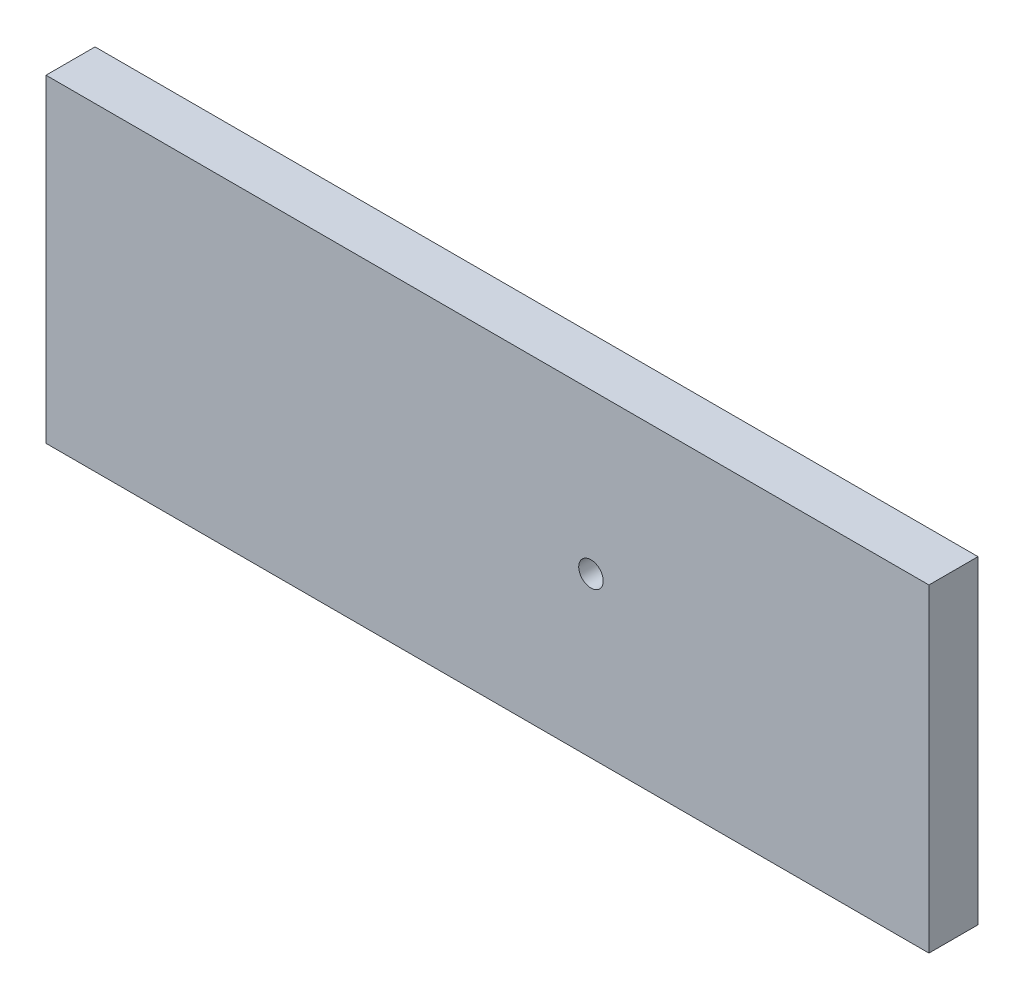
ISO-10303-21;
HEADER;
FILE_DESCRIPTION(('STEP AP214'),'2;1');
FILE_NAME('part.step','',(''),(''),'','','');
FILE_SCHEMA(('AUTOMOTIVE_DESIGN { 1 0 10303 214 1 1 1 1 }'));
ENDSEC;
DATA;
#1=APPLICATION_CONTEXT('core data for automotive mechanical design processes');
#2=APPLICATION_PROTOCOL_DEFINITION('international standard','automotive_design',2000,#1);
#3=PRODUCT_CONTEXT('',#1,'mechanical');
#4=PRODUCT('Part','Part','',(#3));
#5=PRODUCT_RELATED_PRODUCT_CATEGORY('part','',(#4));
#6=PRODUCT_DEFINITION_FORMATION('','',#4);
#7=PRODUCT_DEFINITION_CONTEXT('part definition',#1,'design');
#8=PRODUCT_DEFINITION('design','',#6,#7);
#9=PRODUCT_DEFINITION_SHAPE('','',#8);
#10=(LENGTH_UNIT() NAMED_UNIT(*) SI_UNIT(.MILLI.,.METRE.));
#11=(NAMED_UNIT(*) PLANE_ANGLE_UNIT() SI_UNIT($,.RADIAN.));
#12=(NAMED_UNIT(*) SI_UNIT($,.STERADIAN.) SOLID_ANGLE_UNIT());
#13=UNCERTAINTY_MEASURE_WITH_UNIT(LENGTH_MEASURE(1.E-05),#10,'distance_accuracy_value','');
#14=(GEOMETRIC_REPRESENTATION_CONTEXT(3) GLOBAL_UNCERTAINTY_ASSIGNED_CONTEXT((#13)) GLOBAL_UNIT_ASSIGNED_CONTEXT((#10,
#11,#12)) REPRESENTATION_CONTEXT('',''));
#15=CARTESIAN_POINT('',(0.,0.,0.));
#16=DIRECTION('',(0.,0.,1.));
#17=DIRECTION('',(1.,0.,0.));
#18=AXIS2_PLACEMENT_3D('',#15,#16,#17);
#19=CARTESIAN_POINT('',(0.,0.,12.7));
#20=DIRECTION('',(0.,0.,1.));
#21=DIRECTION('',(1.,0.,0.));
#22=AXIS2_PLACEMENT_3D('',#19,#20,#21);
#23=PLANE('',#22);
#24=DIRECTION('',(0.,1.,0.));
#25=VECTOR('',#24,1.);
#26=CARTESIAN_POINT('',(114.3,41.275,12.7));
#27=LINE('',#26,#25);
#28=CARTESIAN_POINT('',(114.3,-41.275,12.7));
#29=VERTEX_POINT('',#28);
#30=CARTESIAN_POINT('',(114.3,41.275,12.7));
#31=VERTEX_POINT('',#30);
#32=EDGE_CURVE('E91',#29,#31,#27,.T.);
#33=ORIENTED_EDGE('',*,*,#32,.T.);
#34=DIRECTION('',(-1.,0.,0.));
#35=VECTOR('',#34,1.);
#36=CARTESIAN_POINT('',(-114.3,41.275,12.7));
#37=LINE('',#36,#35);
#38=CARTESIAN_POINT('',(-114.3,41.275,12.7));
#39=VERTEX_POINT('',#38);
#40=EDGE_CURVE('E86',#31,#39,#37,.T.);
#41=ORIENTED_EDGE('',*,*,#40,.T.);
#42=DIRECTION('',(0.,-1.,0.));
#43=VECTOR('',#42,1.);
#44=CARTESIAN_POINT('',(-114.3,41.275,12.7));
#45=LINE('',#44,#43);
#46=CARTESIAN_POINT('',(-114.3,-41.275,12.7));
#47=VERTEX_POINT('',#46);
#48=EDGE_CURVE('E89',#39,#47,#45,.T.);
#49=ORIENTED_EDGE('',*,*,#48,.T.);
#50=DIRECTION('',(1.,0.,0.));
#51=VECTOR('',#50,1.);
#52=CARTESIAN_POINT('',(-114.3,-41.275,12.7));
#53=LINE('',#52,#51);
#54=EDGE_CURVE('E56',#47,#29,#53,.T.);
#55=ORIENTED_EDGE('',*,*,#54,.T.);
#56=EDGE_LOOP('',(#33,#41,#49,#55));
#57=FACE_BOUND('',#56,.T.);
#58=CARTESIAN_POINT('',(26.8000000145247,0.,12.7));
#59=DIRECTION('',(0.,0.,1.));
#60=DIRECTION('',(1.,0.,0.));
#61=AXIS2_PLACEMENT_3D('',#58,#59,#60);
#62=CIRCLE('',#61,3.175);
#63=CARTESIAN_POINT('',(29.9750000145247,0.,12.7));
#64=VERTEX_POINT('',#63);
#65=EDGE_CURVE('E111',#64,#64,#62,.T.);
#66=ORIENTED_EDGE('',*,*,#65,.F.);
#67=EDGE_LOOP('',(#66));
#68=FACE_BOUND('',#67,.T.);
#69=ADVANCED_FACE('F38',(#57,#68),#23,.T.);
#70=CARTESIAN_POINT('',(0.,0.,0.));
#71=DIRECTION('',(0.,0.,1.));
#72=DIRECTION('',(1.,0.,0.));
#73=AXIS2_PLACEMENT_3D('',#70,#71,#72);
#74=PLANE('',#73);
#75=DIRECTION('',(0.,1.,0.));
#76=VECTOR('',#75,1.);
#77=CARTESIAN_POINT('',(114.3,41.275,0.));
#78=LINE('',#77,#76);
#79=CARTESIAN_POINT('',(114.3,-41.275,0.));
#80=VERTEX_POINT('',#79);
#81=CARTESIAN_POINT('',(114.3,41.275,0.));
#82=VERTEX_POINT('',#81);
#83=EDGE_CURVE('E107',#80,#82,#78,.T.);
#84=ORIENTED_EDGE('',*,*,#83,.F.);
#85=DIRECTION('',(1.,0.,0.));
#86=VECTOR('',#85,1.);
#87=CARTESIAN_POINT('',(-114.3,-41.275,0.));
#88=LINE('',#87,#86);
#89=CARTESIAN_POINT('',(-114.3,-41.275,0.));
#90=VERTEX_POINT('',#89);
#91=EDGE_CURVE('E79',#90,#80,#88,.T.);
#92=ORIENTED_EDGE('',*,*,#91,.F.);
#93=DIRECTION('',(0.,-1.,0.));
#94=VECTOR('',#93,1.);
#95=CARTESIAN_POINT('',(-114.3,41.275,0.));
#96=LINE('',#95,#94);
#97=CARTESIAN_POINT('',(-114.3,41.275,0.));
#98=VERTEX_POINT('',#97);
#99=EDGE_CURVE('E73',#98,#90,#96,.T.);
#100=ORIENTED_EDGE('',*,*,#99,.F.);
#101=DIRECTION('',(-1.,0.,0.));
#102=VECTOR('',#101,1.);
#103=CARTESIAN_POINT('',(-114.3,41.275,0.));
#104=LINE('',#103,#102);
#105=EDGE_CURVE('E96',#82,#98,#104,.T.);
#106=ORIENTED_EDGE('',*,*,#105,.F.);
#107=EDGE_LOOP('',(#84,#92,#100,#106));
#108=FACE_BOUND('',#107,.T.);
#109=CARTESIAN_POINT('',(26.8000000145247,0.,0.));
#110=DIRECTION('',(0.,0.,1.));
#111=DIRECTION('',(1.,0.,0.));
#112=AXIS2_PLACEMENT_3D('',#109,#110,#111);
#113=CIRCLE('',#112,3.175);
#114=CARTESIAN_POINT('',(29.9750000145247,0.,0.));
#115=VERTEX_POINT('',#114);
#116=EDGE_CURVE('E129',#115,#115,#113,.T.);
#117=ORIENTED_EDGE('',*,*,#116,.T.);
#118=EDGE_LOOP('',(#117));
#119=FACE_BOUND('',#118,.T.);
#120=ADVANCED_FACE('F124',(#108,#119),#74,.F.);
#121=CARTESIAN_POINT('',(114.3,41.275,12.7));
#122=DIRECTION('',(-1.,0.,0.));
#123=DIRECTION('',(0.,0.,1.));
#124=AXIS2_PLACEMENT_3D('',#121,#122,#123);
#125=PLANE('',#124);
#126=ORIENTED_EDGE('',*,*,#83,.T.);
#127=DIRECTION('',(0.,0.,-1.));
#128=VECTOR('',#127,1.);
#129=CARTESIAN_POINT('',(114.3,41.275,12.7));
#130=LINE('',#129,#128);
#131=EDGE_CURVE('E11',#31,#82,#130,.T.);
#132=ORIENTED_EDGE('',*,*,#131,.F.);
#133=ORIENTED_EDGE('',*,*,#32,.F.);
#134=DIRECTION('',(0.,0.,-1.));
#135=VECTOR('',#134,1.);
#136=CARTESIAN_POINT('',(114.3,-41.275,12.7));
#137=LINE('',#136,#135);
#138=EDGE_CURVE('E103',#29,#80,#137,.T.);
#139=ORIENTED_EDGE('',*,*,#138,.T.);
#140=EDGE_LOOP('',(#126,#132,#133,#139));
#141=FACE_BOUND('',#140,.T.);
#142=ADVANCED_FACE('F40',(#141),#125,.F.);
#143=CARTESIAN_POINT('',(-114.3,41.275,12.7));
#144=DIRECTION('',(0.,-1.,0.));
#145=DIRECTION('',(0.,0.,-1.));
#146=AXIS2_PLACEMENT_3D('',#143,#144,#145);
#147=PLANE('',#146);
#148=ORIENTED_EDGE('',*,*,#105,.T.);
#149=DIRECTION('',(0.,0.,-1.));
#150=VECTOR('',#149,1.);
#151=CARTESIAN_POINT('',(-114.3,41.275,12.7));
#152=LINE('',#151,#150);
#153=EDGE_CURVE('E48',#39,#98,#152,.T.);
#154=ORIENTED_EDGE('',*,*,#153,.F.);
#155=ORIENTED_EDGE('',*,*,#40,.F.);
#156=ORIENTED_EDGE('',*,*,#131,.T.);
#157=EDGE_LOOP('',(#148,#154,#155,#156));
#158=FACE_BOUND('',#157,.T.);
#159=ADVANCED_FACE('F95',(#158),#147,.F.);
#160=CARTESIAN_POINT('',(-114.3,41.275,12.7));
#161=DIRECTION('',(1.,0.,0.));
#162=DIRECTION('',(0.,1.,0.));
#163=AXIS2_PLACEMENT_3D('',#160,#161,#162);
#164=PLANE('',#163);
#165=ORIENTED_EDGE('',*,*,#99,.T.);
#166=DIRECTION('',(0.,0.,-1.));
#167=VECTOR('',#166,1.);
#168=CARTESIAN_POINT('',(-114.3,-41.275,12.7));
#169=LINE('',#168,#167);
#170=EDGE_CURVE('E98',#47,#90,#169,.T.);
#171=ORIENTED_EDGE('',*,*,#170,.F.);
#172=ORIENTED_EDGE('',*,*,#48,.F.);
#173=ORIENTED_EDGE('',*,*,#153,.T.);
#174=EDGE_LOOP('',(#165,#171,#172,#173));
#175=FACE_BOUND('',#174,.T.);
#176=ADVANCED_FACE('F99',(#175),#164,.F.);
#177=CARTESIAN_POINT('',(-114.3,-41.275,12.7));
#178=DIRECTION('',(0.,1.,0.));
#179=DIRECTION('',(0.,0.,1.));
#180=AXIS2_PLACEMENT_3D('',#177,#178,#179);
#181=PLANE('',#180);
#182=ORIENTED_EDGE('',*,*,#91,.T.);
#183=ORIENTED_EDGE('',*,*,#138,.F.);
#184=ORIENTED_EDGE('',*,*,#54,.F.);
#185=ORIENTED_EDGE('',*,*,#170,.T.);
#186=EDGE_LOOP('',(#182,#183,#184,#185));
#187=FACE_BOUND('',#186,.T.);
#188=ADVANCED_FACE('F121',(#187),#181,.F.);
#189=CARTESIAN_POINT('',(26.8000000145247,0.,12.7));
#190=DIRECTION('',(0.,0.,-1.));
#191=DIRECTION('',(-1.,0.,0.));
#192=AXIS2_PLACEMENT_3D('',#189,#190,#191);
#193=CYLINDRICAL_SURFACE('',#192,3.175);
#194=ORIENTED_EDGE('',*,*,#65,.T.);
#195=EDGE_LOOP('',(#194));
#196=FACE_BOUND('',#195,.T.);
#197=ORIENTED_EDGE('',*,*,#116,.F.);
#198=EDGE_LOOP('',(#197));
#199=FACE_BOUND('',#198,.T.);
#200=ADVANCED_FACE('F137',(#196,#199),#193,.F.);
#201=CLOSED_SHELL('',(#69,#120,#142,#159,#176,#188,#200));
#202=MANIFOLD_SOLID_BREP('B2',#201);
#203=ADVANCED_BREP_SHAPE_REPRESENTATION('',(#18,#202),#14);
#204=SHAPE_DEFINITION_REPRESENTATION(#9,#203);
ENDSEC;
END-ISO-10303-21;
